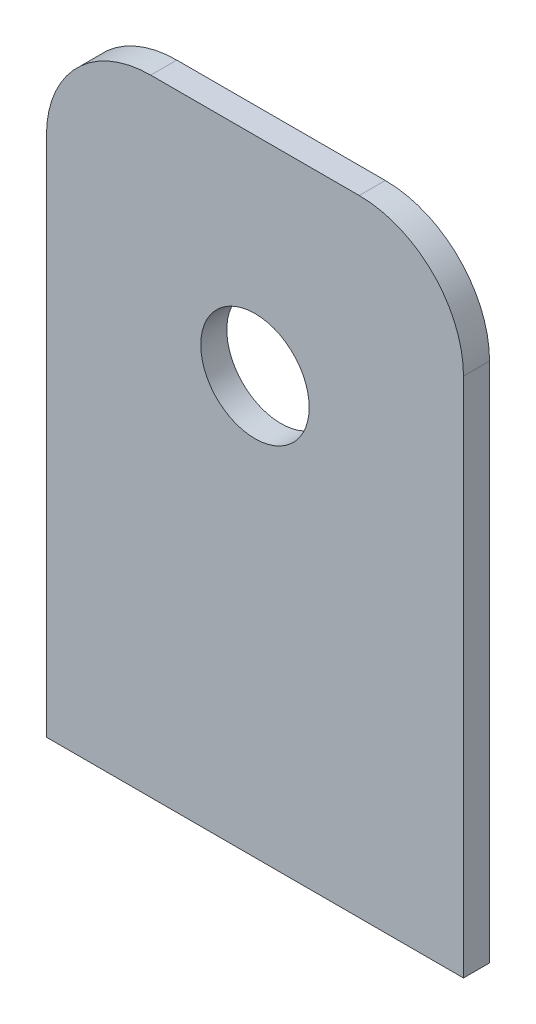
ISO-10303-21;
HEADER;
FILE_DESCRIPTION(('STEP AP214'),'2;1');
FILE_NAME('part.step','',(''),(''),'','','');
FILE_SCHEMA(('AUTOMOTIVE_DESIGN { 1 0 10303 214 1 1 1 1 }'));
ENDSEC;
DATA;
#1=APPLICATION_CONTEXT('core data for automotive mechanical design processes');
#2=APPLICATION_PROTOCOL_DEFINITION('international standard','automotive_design',2000,#1);
#3=PRODUCT_CONTEXT('',#1,'mechanical');
#4=PRODUCT('Part','Part','',(#3));
#5=PRODUCT_RELATED_PRODUCT_CATEGORY('part','',(#4));
#6=PRODUCT_DEFINITION_FORMATION('','',#4);
#7=PRODUCT_DEFINITION_CONTEXT('part definition',#1,'design');
#8=PRODUCT_DEFINITION('design','',#6,#7);
#9=PRODUCT_DEFINITION_SHAPE('','',#8);
#10=(LENGTH_UNIT() NAMED_UNIT(*) SI_UNIT(.MILLI.,.METRE.));
#11=(NAMED_UNIT(*) PLANE_ANGLE_UNIT() SI_UNIT($,.RADIAN.));
#12=(NAMED_UNIT(*) SI_UNIT($,.STERADIAN.) SOLID_ANGLE_UNIT());
#13=UNCERTAINTY_MEASURE_WITH_UNIT(LENGTH_MEASURE(1.E-05),#10,'distance_accuracy_value','');
#14=(GEOMETRIC_REPRESENTATION_CONTEXT(3) GLOBAL_UNCERTAINTY_ASSIGNED_CONTEXT((#13)) GLOBAL_UNIT_ASSIGNED_CONTEXT((#10,
#11,#12)) REPRESENTATION_CONTEXT('',''));
#15=CARTESIAN_POINT('',(0.,0.,0.));
#16=DIRECTION('',(0.,0.,1.));
#17=DIRECTION('',(1.,0.,0.));
#18=AXIS2_PLACEMENT_3D('',#15,#16,#17);
#19=CARTESIAN_POINT('',(-12.7,0.,1.5875));
#20=DIRECTION('',(1.,0.,0.));
#21=DIRECTION('',(0.,0.,-1.));
#22=AXIS2_PLACEMENT_3D('',#19,#20,#21);
#23=PLANE('',#22);
#24=DIRECTION('',(0.,-1.,0.));
#25=VECTOR('',#24,1.);
#26=CARTESIAN_POINT('',(-12.7,0.,1.5875));
#27=LINE('',#26,#25);
#28=CARTESIAN_POINT('',(-12.7,31.75,1.5875));
#29=VERTEX_POINT('',#28);
#30=CARTESIAN_POINT('',(-12.7,0.,1.5875));
#31=VERTEX_POINT('',#30);
#32=EDGE_CURVE('E93',#29,#31,#27,.T.);
#33=ORIENTED_EDGE('',*,*,#32,.F.);
#34=DIRECTION('',(0.,0.,-1.));
#35=VECTOR('',#34,1.);
#36=CARTESIAN_POINT('',(-12.7,31.75,1.5875));
#37=LINE('',#36,#35);
#38=CARTESIAN_POINT('',(-12.7,31.75,0.));
#39=VERTEX_POINT('',#38);
#40=EDGE_CURVE('E11',#29,#39,#37,.T.);
#41=ORIENTED_EDGE('',*,*,#40,.T.);
#42=DIRECTION('',(0.,-1.,0.));
#43=VECTOR('',#42,1.);
#44=CARTESIAN_POINT('',(-12.7,0.,0.));
#45=LINE('',#44,#43);
#46=CARTESIAN_POINT('',(-12.7,0.,0.));
#47=VERTEX_POINT('',#46);
#48=EDGE_CURVE('E112',#39,#47,#45,.T.);
#49=ORIENTED_EDGE('',*,*,#48,.T.);
#50=DIRECTION('',(0.,0.,-1.));
#51=VECTOR('',#50,1.);
#52=CARTESIAN_POINT('',(-12.7,0.,1.5875));
#53=LINE('',#52,#51);
#54=EDGE_CURVE('E106',#31,#47,#53,.T.);
#55=ORIENTED_EDGE('',*,*,#54,.F.);
#56=EDGE_LOOP('',(#33,#41,#49,#55));
#57=FACE_BOUND('',#56,.T.);
#58=ADVANCED_FACE('F40',(#57),#23,.F.);
#59=CARTESIAN_POINT('',(-12.7,0.,1.5875));
#60=DIRECTION('',(0.,1.,0.));
#61=DIRECTION('',(0.,0.,1.));
#62=AXIS2_PLACEMENT_3D('',#59,#60,#61);
#63=PLANE('',#62);
#64=DIRECTION('',(1.,0.,0.));
#65=VECTOR('',#64,1.);
#66=CARTESIAN_POINT('',(-12.7,0.,0.));
#67=LINE('',#66,#65);
#68=CARTESIAN_POINT('',(12.7,0.,0.));
#69=VERTEX_POINT('',#68);
#70=EDGE_CURVE('E145',#47,#69,#67,.T.);
#71=ORIENTED_EDGE('',*,*,#70,.T.);
#72=DIRECTION('',(0.,0.,-1.));
#73=VECTOR('',#72,1.);
#74=CARTESIAN_POINT('',(12.7,0.,1.5875));
#75=LINE('',#74,#73);
#76=CARTESIAN_POINT('',(12.7,0.,1.5875));
#77=VERTEX_POINT('',#76);
#78=EDGE_CURVE('E108',#77,#69,#75,.T.);
#79=ORIENTED_EDGE('',*,*,#78,.F.);
#80=DIRECTION('',(1.,0.,0.));
#81=VECTOR('',#80,1.);
#82=CARTESIAN_POINT('',(-12.7,0.,1.5875));
#83=LINE('',#82,#81);
#84=EDGE_CURVE('E96',#31,#77,#83,.T.);
#85=ORIENTED_EDGE('',*,*,#84,.F.);
#86=ORIENTED_EDGE('',*,*,#54,.T.);
#87=EDGE_LOOP('',(#71,#79,#85,#86));
#88=FACE_BOUND('',#87,.T.);
#89=ADVANCED_FACE('F105',(#88),#63,.F.);
#90=CARTESIAN_POINT('',(12.7,0.,1.5875));
#91=DIRECTION('',(-1.,0.,0.));
#92=DIRECTION('',(0.,0.,1.));
#93=AXIS2_PLACEMENT_3D('',#90,#91,#92);
#94=PLANE('',#93);
#95=DIRECTION('',(0.,1.,0.));
#96=VECTOR('',#95,1.);
#97=CARTESIAN_POINT('',(12.7,0.,0.));
#98=LINE('',#97,#96);
#99=CARTESIAN_POINT('',(12.7,31.75,0.));
#100=VERTEX_POINT('',#99);
#101=EDGE_CURVE('E143',#69,#100,#98,.T.);
#102=ORIENTED_EDGE('',*,*,#101,.T.);
#103=DIRECTION('',(0.,0.,-1.));
#104=VECTOR('',#103,1.);
#105=CARTESIAN_POINT('',(12.7,31.75,1.5875));
#106=LINE('',#105,#104);
#107=CARTESIAN_POINT('',(12.7,31.75,1.5875));
#108=VERTEX_POINT('',#107);
#109=EDGE_CURVE('E63',#100,#108,#106,.F.);
#110=ORIENTED_EDGE('',*,*,#109,.T.);
#111=DIRECTION('',(0.,1.,0.));
#112=VECTOR('',#111,1.);
#113=CARTESIAN_POINT('',(12.7,0.,1.5875));
#114=LINE('',#113,#112);
#115=EDGE_CURVE('E109',#77,#108,#114,.T.);
#116=ORIENTED_EDGE('',*,*,#115,.F.);
#117=ORIENTED_EDGE('',*,*,#78,.T.);
#118=EDGE_LOOP('',(#102,#110,#116,#117));
#119=FACE_BOUND('',#118,.T.);
#120=ADVANCED_FACE('F144',(#119),#94,.F.);
#121=CARTESIAN_POINT('',(-12.7,38.1,1.5875));
#122=DIRECTION('',(0.,-1.,0.));
#123=DIRECTION('',(1.,0.,0.));
#124=AXIS2_PLACEMENT_3D('',#121,#122,#123);
#125=PLANE('',#124);
#126=DIRECTION('',(-1.,0.,0.));
#127=VECTOR('',#126,1.);
#128=CARTESIAN_POINT('',(-12.7,38.1,1.5875));
#129=LINE('',#128,#127);
#130=CARTESIAN_POINT('',(6.35,38.1,1.5875));
#131=VERTEX_POINT('',#130);
#132=CARTESIAN_POINT('',(-6.35,38.1,1.5875));
#133=VERTEX_POINT('',#132);
#134=EDGE_CURVE('E118',#131,#133,#129,.T.);
#135=ORIENTED_EDGE('',*,*,#134,.F.);
#136=DIRECTION('',(0.,0.,-1.));
#137=VECTOR('',#136,1.);
#138=CARTESIAN_POINT('',(6.35,38.1,1.5875));
#139=LINE('',#138,#137);
#140=CARTESIAN_POINT('',(6.35,38.1,0.));
#141=VERTEX_POINT('',#140);
#142=EDGE_CURVE('E116',#131,#141,#139,.T.);
#143=ORIENTED_EDGE('',*,*,#142,.T.);
#144=DIRECTION('',(-1.,0.,0.));
#145=VECTOR('',#144,1.);
#146=CARTESIAN_POINT('',(-12.7,38.1,0.));
#147=LINE('',#146,#145);
#148=CARTESIAN_POINT('',(-6.35,38.1,0.));
#149=VERTEX_POINT('',#148);
#150=EDGE_CURVE('E101',#141,#149,#147,.T.);
#151=ORIENTED_EDGE('',*,*,#150,.T.);
#152=DIRECTION('',(0.,0.,-1.));
#153=VECTOR('',#152,1.);
#154=CARTESIAN_POINT('',(-6.35,38.1,1.5875));
#155=LINE('',#154,#153);
#156=EDGE_CURVE('E114',#149,#133,#155,.F.);
#157=ORIENTED_EDGE('',*,*,#156,.T.);
#158=EDGE_LOOP('',(#135,#143,#151,#157));
#159=FACE_BOUND('',#158,.T.);
#160=ADVANCED_FACE('F134',(#159),#125,.F.);
#161=CARTESIAN_POINT('',(0.,0.,1.5875));
#162=DIRECTION('',(0.,0.,-1.));
#163=DIRECTION('',(-1.,0.,0.));
#164=AXIS2_PLACEMENT_3D('',#161,#162,#163);
#165=PLANE('',#164);
#166=CARTESIAN_POINT('',(0.,25.4,1.5875));
#167=DIRECTION('',(0.,0.,-1.));
#168=DIRECTION('',(-1.,0.,0.));
#169=AXIS2_PLACEMENT_3D('',#166,#167,#168);
#170=CIRCLE('',#169,3.302);
#171=CARTESIAN_POINT('',(-3.302,25.4,1.5875));
#172=VERTEX_POINT('',#171);
#173=EDGE_CURVE('E149',#172,#172,#170,.T.);
#174=ORIENTED_EDGE('',*,*,#173,.T.);
#175=EDGE_LOOP('',(#174));
#176=FACE_BOUND('',#175,.T.);
#177=ORIENTED_EDGE('',*,*,#115,.T.);
#178=CARTESIAN_POINT('',(6.35,31.75,1.5875));
#179=DIRECTION('',(0.,0.,-1.));
#180=DIRECTION('',(-1.,0.,0.));
#181=AXIS2_PLACEMENT_3D('',#178,#179,#180);
#182=CIRCLE('',#181,6.35);
#183=EDGE_CURVE('E48',#108,#131,#182,.F.);
#184=ORIENTED_EDGE('',*,*,#183,.T.);
#185=ORIENTED_EDGE('',*,*,#134,.T.);
#186=CARTESIAN_POINT('',(-6.35,31.75,1.5875));
#187=DIRECTION('',(0.,0.,-1.));
#188=DIRECTION('',(-1.,0.,0.));
#189=AXIS2_PLACEMENT_3D('',#186,#187,#188);
#190=CIRCLE('',#189,6.35);
#191=EDGE_CURVE('E55',#133,#29,#190,.F.);
#192=ORIENTED_EDGE('',*,*,#191,.T.);
#193=ORIENTED_EDGE('',*,*,#32,.T.);
#194=ORIENTED_EDGE('',*,*,#84,.T.);
#195=EDGE_LOOP('',(#177,#184,#185,#192,#193,#194));
#196=FACE_BOUND('',#195,.T.);
#197=ADVANCED_FACE('F95',(#176,#196),#165,.F.);
#198=CARTESIAN_POINT('',(0.,0.,0.));
#199=DIRECTION('',(0.,0.,-1.));
#200=DIRECTION('',(-1.,0.,0.));
#201=AXIS2_PLACEMENT_3D('',#198,#199,#200);
#202=PLANE('',#201);
#203=CARTESIAN_POINT('',(0.,25.4,0.));
#204=DIRECTION('',(0.,0.,1.));
#205=DIRECTION('',(1.,0.,0.));
#206=AXIS2_PLACEMENT_3D('',#203,#204,#205);
#207=CIRCLE('',#206,3.302);
#208=CARTESIAN_POINT('',(3.302,25.4,0.));
#209=VERTEX_POINT('',#208);
#210=EDGE_CURVE('E154',#209,#209,#207,.T.);
#211=ORIENTED_EDGE('',*,*,#210,.T.);
#212=EDGE_LOOP('',(#211));
#213=FACE_BOUND('',#212,.T.);
#214=ORIENTED_EDGE('',*,*,#150,.F.);
#215=CARTESIAN_POINT('',(6.35,31.75,0.));
#216=DIRECTION('',(0.,0.,-1.));
#217=DIRECTION('',(-1.,0.,0.));
#218=AXIS2_PLACEMENT_3D('',#215,#216,#217);
#219=CIRCLE('',#218,6.35);
#220=EDGE_CURVE('E126',#141,#100,#219,.T.);
#221=ORIENTED_EDGE('',*,*,#220,.T.);
#222=ORIENTED_EDGE('',*,*,#101,.F.);
#223=ORIENTED_EDGE('',*,*,#70,.F.);
#224=ORIENTED_EDGE('',*,*,#48,.F.);
#225=CARTESIAN_POINT('',(-6.35,31.75,0.));
#226=DIRECTION('',(0.,0.,-1.));
#227=DIRECTION('',(-1.,0.,0.));
#228=AXIS2_PLACEMENT_3D('',#225,#226,#227);
#229=CIRCLE('',#228,6.35);
#230=EDGE_CURVE('E124',#39,#149,#229,.T.);
#231=ORIENTED_EDGE('',*,*,#230,.T.);
#232=EDGE_LOOP('',(#214,#221,#222,#223,#224,#231));
#233=FACE_BOUND('',#232,.T.);
#234=ADVANCED_FACE('F142',(#213,#233),#202,.T.);
#235=CARTESIAN_POINT('',(0.,25.4,0.));
#236=DIRECTION('',(0.,0.,1.));
#237=DIRECTION('',(1.,0.,0.));
#238=AXIS2_PLACEMENT_3D('',#235,#236,#237);
#239=CYLINDRICAL_SURFACE('',#238,3.302);
#240=ORIENTED_EDGE('',*,*,#210,.F.);
#241=EDGE_LOOP('',(#240));
#242=FACE_BOUND('',#241,.T.);
#243=ORIENTED_EDGE('',*,*,#173,.F.);
#244=EDGE_LOOP('',(#243));
#245=FACE_BOUND('',#244,.T.);
#246=ADVANCED_FACE('F159',(#242,#245),#239,.F.);
#247=CARTESIAN_POINT('',(6.35,31.75,1.5875));
#248=DIRECTION('',(0.,0.,-1.));
#249=DIRECTION('',(-1.,0.,0.));
#250=AXIS2_PLACEMENT_3D('',#247,#248,#249);
#251=CYLINDRICAL_SURFACE('',#250,6.35);
#252=ORIENTED_EDGE('',*,*,#183,.F.);
#253=ORIENTED_EDGE('',*,*,#109,.F.);
#254=ORIENTED_EDGE('',*,*,#220,.F.);
#255=ORIENTED_EDGE('',*,*,#142,.F.);
#256=EDGE_LOOP('',(#252,#253,#254,#255));
#257=FACE_BOUND('',#256,.T.);
#258=ADVANCED_FACE('F139',(#257),#251,.T.);
#259=CARTESIAN_POINT('',(-6.35,31.75,1.5875));
#260=DIRECTION('',(0.,0.,-1.));
#261=DIRECTION('',(-1.,0.,0.));
#262=AXIS2_PLACEMENT_3D('',#259,#260,#261);
#263=CYLINDRICAL_SURFACE('',#262,6.35);
#264=ORIENTED_EDGE('',*,*,#191,.F.);
#265=ORIENTED_EDGE('',*,*,#156,.F.);
#266=ORIENTED_EDGE('',*,*,#230,.F.);
#267=ORIENTED_EDGE('',*,*,#40,.F.);
#268=EDGE_LOOP('',(#264,#265,#266,#267));
#269=FACE_BOUND('',#268,.T.);
#270=ADVANCED_FACE('F42',(#269),#263,.T.);
#271=CLOSED_SHELL('',(#58,#89,#120,#160,#197,#234,#246,#258,#270));
#272=MANIFOLD_SOLID_BREP('B2',#271);
#273=ADVANCED_BREP_SHAPE_REPRESENTATION('',(#18,#272),#14);
#274=SHAPE_DEFINITION_REPRESENTATION(#9,#273);
ENDSEC;
END-ISO-10303-21;
